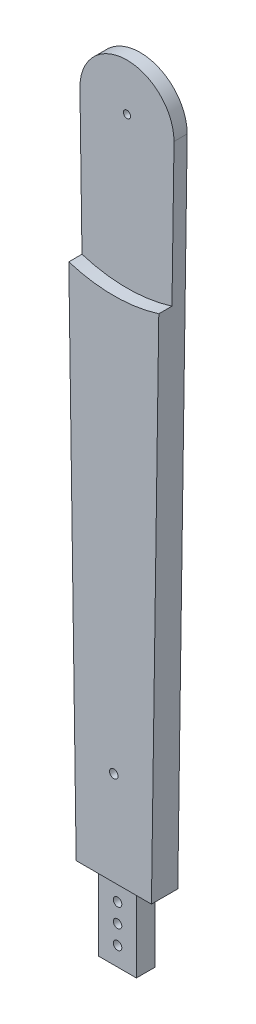
ISO-10303-21;
HEADER;
FILE_DESCRIPTION(('STEP AP214'),'2;1');
FILE_NAME('part.step','',(''),(''),'','','');
FILE_SCHEMA(('AUTOMOTIVE_DESIGN { 1 0 10303 214 1 1 1 1 }'));
ENDSEC;
DATA;
#1=APPLICATION_CONTEXT('core data for automotive mechanical design processes');
#2=APPLICATION_PROTOCOL_DEFINITION('international standard','automotive_design',2000,#1);
#3=PRODUCT_CONTEXT('',#1,'mechanical');
#4=PRODUCT('Part','Part','',(#3));
#5=PRODUCT_RELATED_PRODUCT_CATEGORY('part','',(#4));
#6=PRODUCT_DEFINITION_FORMATION('','',#4);
#7=PRODUCT_DEFINITION_CONTEXT('part definition',#1,'design');
#8=PRODUCT_DEFINITION('design','',#6,#7);
#9=PRODUCT_DEFINITION_SHAPE('','',#8);
#10=(LENGTH_UNIT() NAMED_UNIT(*) SI_UNIT(.MILLI.,.METRE.));
#11=(NAMED_UNIT(*) PLANE_ANGLE_UNIT() SI_UNIT($,.RADIAN.));
#12=(NAMED_UNIT(*) SI_UNIT($,.STERADIAN.) SOLID_ANGLE_UNIT());
#13=UNCERTAINTY_MEASURE_WITH_UNIT(LENGTH_MEASURE(1.E-05),#10,'distance_accuracy_value','');
#14=(GEOMETRIC_REPRESENTATION_CONTEXT(3) GLOBAL_UNCERTAINTY_ASSIGNED_CONTEXT((#13)) GLOBAL_UNIT_ASSIGNED_CONTEXT((#10,
#11,#12)) REPRESENTATION_CONTEXT('',''));
#15=CARTESIAN_POINT('',(0.,0.,0.));
#16=DIRECTION('',(0.,0.,1.));
#17=DIRECTION('',(1.,0.,0.));
#18=AXIS2_PLACEMENT_3D('',#15,#16,#17);
#19=CARTESIAN_POINT('',(0.,-380.,-4.99999999999999));
#20=DIRECTION('',(0.,0.,1.));
#21=DIRECTION('',(1.,0.,0.));
#22=AXIS2_PLACEMENT_3D('',#19,#20,#21);
#23=CYLINDRICAL_SURFACE('',#22,2.25);
#24=CARTESIAN_POINT('',(0.,-380.,-4.99999999999999));
#25=DIRECTION('',(0.,0.,1.));
#26=DIRECTION('',(1.,0.,0.));
#27=AXIS2_PLACEMENT_3D('',#24,#25,#26);
#28=CIRCLE('',#27,2.25);
#29=CARTESIAN_POINT('',(2.25,-380.,-4.99999999999999));
#30=VERTEX_POINT('',#29);
#31=EDGE_CURVE('E48',#30,#30,#28,.T.);
#32=CARTESIAN_POINT('',(0.,-380.,5.));
#33=DIRECTION('',(0.,0.,1.));
#34=DIRECTION('',(1.,0.,0.));
#35=AXIS2_PLACEMENT_3D('',#32,#33,#34);
#36=CIRCLE('',#35,2.25);
#37=CARTESIAN_POINT('',(2.25,-380.,5.));
#38=VERTEX_POINT('',#37);
#39=EDGE_CURVE('E11',#38,#38,#36,.T.);
#40=CARTESIAN_POINT('',(2.25,-380.,-4.99999999999999));
#41=CARTESIAN_POINT('',(2.25,-380.,-4.89583333333332));
#42=CARTESIAN_POINT('',(2.25,-380.,-4.79166666666666));
#43=CARTESIAN_POINT('',(2.25,-380.,-4.58333333333333));
#44=CARTESIAN_POINT('',(2.25,-380.,-4.47916666666666));
#45=CARTESIAN_POINT('',(2.25,-380.,-4.27083333333333));
#46=CARTESIAN_POINT('',(2.25,-380.,-4.16666666666666));
#47=CARTESIAN_POINT('',(2.25,-380.,-3.95833333333333));
#48=CARTESIAN_POINT('',(2.25,-380.,-3.85416666666666));
#49=CARTESIAN_POINT('',(2.25,-380.,-3.64583333333333));
#50=CARTESIAN_POINT('',(2.25,-380.,-3.54166666666666));
#51=CARTESIAN_POINT('',(2.25,-380.,-3.33333333333333));
#52=CARTESIAN_POINT('',(2.25,-380.,-3.22916666666666));
#53=CARTESIAN_POINT('',(2.25,-380.,-3.02083333333333));
#54=CARTESIAN_POINT('',(2.25,-380.,-2.91666666666666));
#55=CARTESIAN_POINT('',(2.25,-380.,-2.70833333333333));
#56=CARTESIAN_POINT('',(2.25,-380.,-2.60416666666666));
#57=CARTESIAN_POINT('',(2.25,-380.,-2.39583333333333));
#58=CARTESIAN_POINT('',(2.25,-380.,-2.29166666666666));
#59=CARTESIAN_POINT('',(2.25,-380.,-2.08333333333333));
#60=CARTESIAN_POINT('',(2.25,-380.,-1.97916666666666));
#61=CARTESIAN_POINT('',(2.25,-380.,-1.77083333333333));
#62=CARTESIAN_POINT('',(2.25,-380.,-1.66666666666666));
#63=CARTESIAN_POINT('',(2.25,-380.,-1.45833333333333));
#64=CARTESIAN_POINT('',(2.25,-380.,-1.35416666666666));
#65=CARTESIAN_POINT('',(2.25,-380.,-1.14583333333333));
#66=CARTESIAN_POINT('',(2.25,-380.,-1.04166666666666));
#67=CARTESIAN_POINT('',(2.25,-380.,-0.83333333333333));
#68=CARTESIAN_POINT('',(2.25,-380.,-0.729166666666663));
#69=CARTESIAN_POINT('',(2.25,-380.,-0.52083333333333));
#70=CARTESIAN_POINT('',(2.25,-380.,-0.416666666666663));
#71=CARTESIAN_POINT('',(2.25,-380.,-0.20833333333333));
#72=CARTESIAN_POINT('',(2.25,-380.,-0.104166666666664));
#73=CARTESIAN_POINT('',(2.25,-380.,0.104166666666669));
#74=CARTESIAN_POINT('',(2.25,-380.,0.208333333333336));
#75=CARTESIAN_POINT('',(2.25,-380.,0.416666666666668));
#76=CARTESIAN_POINT('',(2.25,-380.,0.520833333333335));
#77=CARTESIAN_POINT('',(2.25,-380.,0.729166666666668));
#78=CARTESIAN_POINT('',(2.25,-380.,0.833333333333335));
#79=CARTESIAN_POINT('',(2.25,-380.,1.04166666666667));
#80=CARTESIAN_POINT('',(2.25,-380.,1.14583333333333));
#81=CARTESIAN_POINT('',(2.25,-380.,1.35416666666667));
#82=CARTESIAN_POINT('',(2.25,-380.,1.45833333333333));
#83=CARTESIAN_POINT('',(2.25,-380.,1.66666666666667));
#84=CARTESIAN_POINT('',(2.25,-380.,1.77083333333333));
#85=CARTESIAN_POINT('',(2.25,-380.,1.97916666666667));
#86=CARTESIAN_POINT('',(2.25,-380.,2.08333333333333));
#87=CARTESIAN_POINT('',(2.25,-380.,2.29166666666667));
#88=CARTESIAN_POINT('',(2.25,-380.,2.39583333333333));
#89=CARTESIAN_POINT('',(2.25,-380.,2.60416666666667));
#90=CARTESIAN_POINT('',(2.25,-380.,2.70833333333333));
#91=CARTESIAN_POINT('',(2.25,-380.,2.91666666666667));
#92=CARTESIAN_POINT('',(2.25,-380.,3.02083333333333));
#93=CARTESIAN_POINT('',(2.25,-380.,3.22916666666666));
#94=CARTESIAN_POINT('',(2.25,-380.,3.33333333333333));
#95=CARTESIAN_POINT('',(2.25,-380.,3.54166666666666));
#96=CARTESIAN_POINT('',(2.25,-380.,3.64583333333333));
#97=CARTESIAN_POINT('',(2.25,-380.,3.85416666666666));
#98=CARTESIAN_POINT('',(2.25,-380.,3.95833333333333));
#99=CARTESIAN_POINT('',(2.25,-380.,4.16666666666666));
#100=CARTESIAN_POINT('',(2.25,-380.,4.27083333333333));
#101=CARTESIAN_POINT('',(2.25,-380.,4.47916666666666));
#102=CARTESIAN_POINT('',(2.25,-380.,4.58333333333333));
#103=CARTESIAN_POINT('',(2.25,-380.,4.79166666666666));
#104=CARTESIAN_POINT('',(2.25,-380.,4.89583333333333));
#105=CARTESIAN_POINT('',(2.25,-380.,5.));
#106=B_SPLINE_CURVE_WITH_KNOTS('',3,(#40,#41,#42,#43,#44,#45,#46,#47,#48,#49,#50,#51,#52,#53,
#54,#55,#56,#57,#58,#59,#60,#61,#62,#63,#64,#65,#66,#67,#68,#69,#70,#71,#72,#73,#74,#75,#76,#77,
#78,#79,#80,#81,#82,#83,#84,#85,#86,#87,#88,#89,#90,#91,#92,#93,#94,#95,#96,#97,#98,#99,#100,
#101,#102,#103,#104,#105),.UNSPECIFIED.,.F.,.F.,(4,2,2,2,2,2,2,2,2,2,2,2,2,2,2,2,2,2,2,2,2,2,2,
2,2,2,2,2,2,2,2,2,4),(0.,0.312499999999999,0.624999999999999,0.937499999999998,1.25,1.5625,
1.875,2.1875,2.5,2.8125,3.125,3.4375,3.74999999999999,4.06249999999999,4.37499999999999,
4.68749999999999,4.99999999999999,5.31249999999999,5.62499999999999,5.93749999999999,
6.24999999999999,6.56249999999999,6.87499999999999,7.18749999999999,7.49999999999999,
7.81249999999999,8.12499999999999,8.43749999999999,8.74999999999999,9.06249999999999,
9.37499999999999,9.68749999999999,9.99999999999999),.UNSPECIFIED.);
#107=EDGE_CURVE('BSEAM41',#30,#38,#106,.T.);
#108=ORIENTED_EDGE('',*,*,#31,.F.);
#109=ORIENTED_EDGE('',*,*,#39,.T.);
#110=ORIENTED_EDGE('',*,*,#107,.T.);
#111=ORIENTED_EDGE('',*,*,#107,.F.);
#112=EDGE_LOOP('',(#108,#110,#109,#111));
#113=FACE_BOUND('',#112,.T.);
#114=ADVANCED_FACE('F41',(#113),#23,.F.);
#115=CARTESIAN_POINT('',(0.,-350.,7.));
#116=DIRECTION('',(0.,1.,0.));
#117=DIRECTION('',(0.,0.,1.));
#118=AXIS2_PLACEMENT_3D('',#115,#116,#117);
#119=PLANE('',#118);
#120=DIRECTION('',(1.,0.,0.));
#121=VECTOR('',#120,1.);
#122=CARTESIAN_POINT('',(0.,-350.,-7.));
#123=LINE('',#122,#121);
#124=CARTESIAN_POINT('',(-20.0000000000004,-350.,-7.));
#125=VERTEX_POINT('',#124);
#126=CARTESIAN_POINT('',(19.9999999999996,-350.,-7.));
#127=VERTEX_POINT('',#126);
#128=EDGE_CURVE('E182',#125,#127,#123,.T.);
#129=ORIENTED_EDGE('',*,*,#128,.T.);
#130=DIRECTION('',(0.,0.,-1.));
#131=VECTOR('',#130,1.);
#132=CARTESIAN_POINT('',(19.9999999999996,-350.,7.));
#133=LINE('',#132,#131);
#134=CARTESIAN_POINT('',(19.9999999999996,-350.,7.));
#135=VERTEX_POINT('',#134);
#136=EDGE_CURVE('E193',#135,#127,#133,.T.);
#137=ORIENTED_EDGE('',*,*,#136,.F.);
#138=DIRECTION('',(1.,0.,0.));
#139=VECTOR('',#138,1.);
#140=CARTESIAN_POINT('',(0.,-350.,7.));
#141=LINE('',#140,#139);
#142=CARTESIAN_POINT('',(-20.0000000000004,-350.,7.));
#143=VERTEX_POINT('',#142);
#144=EDGE_CURVE('E173',#143,#135,#141,.T.);
#145=ORIENTED_EDGE('',*,*,#144,.F.);
#146=DIRECTION('',(0.,0.,-1.));
#147=VECTOR('',#146,1.);
#148=CARTESIAN_POINT('',(-20.0000000000004,-350.,7.));
#149=LINE('',#148,#147);
#150=EDGE_CURVE('E195',#143,#125,#149,.T.);
#151=ORIENTED_EDGE('',*,*,#150,.T.);
#152=EDGE_LOOP('',(#129,#137,#145,#151));
#153=FACE_BOUND('',#152,.T.);
#154=DIRECTION('',(0.,0.,1.));
#155=VECTOR('',#154,1.);
#156=CARTESIAN_POINT('',(10.,-350.,-5.));
#157=LINE('',#156,#155);
#158=CARTESIAN_POINT('',(10.,-350.,-5.));
#159=VERTEX_POINT('',#158);
#160=CARTESIAN_POINT('',(10.,-350.,5.));
#161=VERTEX_POINT('',#160);
#162=EDGE_CURVE('E55',#159,#161,#157,.T.);
#163=ORIENTED_EDGE('',*,*,#162,.F.);
#164=DIRECTION('',(1.,0.,0.));
#165=VECTOR('',#164,1.);
#166=CARTESIAN_POINT('',(-10.,-350.,-5.));
#167=LINE('',#166,#165);
#168=CARTESIAN_POINT('',(-10.,-350.,-5.));
#169=VERTEX_POINT('',#168);
#170=EDGE_CURVE('E59',#169,#159,#167,.T.);
#171=ORIENTED_EDGE('',*,*,#170,.F.);
#172=DIRECTION('',(0.,0.,-1.));
#173=VECTOR('',#172,1.);
#174=CARTESIAN_POINT('',(-10.,-350.,-5.));
#175=LINE('',#174,#173);
#176=CARTESIAN_POINT('',(-10.,-350.,5.));
#177=VERTEX_POINT('',#176);
#178=EDGE_CURVE('E394',#177,#169,#175,.T.);
#179=ORIENTED_EDGE('',*,*,#178,.F.);
#180=DIRECTION('',(-1.,0.,0.));
#181=VECTOR('',#180,1.);
#182=CARTESIAN_POINT('',(-10.,-350.,5.));
#183=LINE('',#182,#181);
#184=EDGE_CURVE('E392',#161,#177,#183,.T.);
#185=ORIENTED_EDGE('',*,*,#184,.F.);
#186=EDGE_LOOP('',(#163,#171,#179,#185));
#187=FACE_BOUND('',#186,.T.);
#188=ADVANCED_FACE('F206',(#153,#187),#119,.F.);
#189=CARTESIAN_POINT('',(0.,0.,7.));
#190=DIRECTION('',(0.,0.,-1.));
#191=DIRECTION('',(-1.,0.,0.));
#192=AXIS2_PLACEMENT_3D('',#189,#190,#191);
#193=CYLINDRICAL_SURFACE('',#192,25.);
#194=CARTESIAN_POINT('',(0.,0.,0.));
#195=DIRECTION('',(0.,0.,1.));
#196=DIRECTION('',(1.,0.,0.));
#197=AXIS2_PLACEMENT_3D('',#194,#195,#196);
#198=CIRCLE('',#197,25.);
#199=CARTESIAN_POINT('',(25.,0.,0.));
#200=VERTEX_POINT('',#199);
#201=CARTESIAN_POINT('',(-25.,0.,0.));
#202=VERTEX_POINT('',#201);
#203=EDGE_CURVE('E198',#200,#202,#198,.T.);
#204=ORIENTED_EDGE('',*,*,#203,.F.);
#205=DIRECTION('',(0.,0.,-1.));
#206=VECTOR('',#205,1.);
#207=CARTESIAN_POINT('',(25.,0.,7.));
#208=LINE('',#207,#206);
#209=CARTESIAN_POINT('',(25.,0.,-7.));
#210=VERTEX_POINT('',#209);
#211=EDGE_CURVE('E191',#200,#210,#208,.T.);
#212=ORIENTED_EDGE('',*,*,#211,.T.);
#213=CARTESIAN_POINT('',(0.,0.,-7.));
#214=DIRECTION('',(0.,0.,1.));
#215=DIRECTION('',(1.,0.,0.));
#216=AXIS2_PLACEMENT_3D('',#213,#214,#215);
#217=CIRCLE('',#216,25.);
#218=CARTESIAN_POINT('',(-25.,0.,-7.));
#219=VERTEX_POINT('',#218);
#220=EDGE_CURVE('E174',#210,#219,#217,.T.);
#221=ORIENTED_EDGE('',*,*,#220,.T.);
#222=DIRECTION('',(0.,0.,-1.));
#223=VECTOR('',#222,1.);
#224=CARTESIAN_POINT('',(-25.,0.,7.));
#225=LINE('',#224,#223);
#226=EDGE_CURVE('E179',#202,#219,#225,.T.);
#227=ORIENTED_EDGE('',*,*,#226,.F.);
#228=EDGE_LOOP('',(#204,#212,#221,#227));
#229=FACE_BOUND('',#228,.T.);
#230=ADVANCED_FACE('F248',(#229),#193,.T.);
#231=CARTESIAN_POINT('',(-24.994899000204,-0.357069985717169,7.));
#232=DIRECTION('',(0.99989797479951,0.0142842567828489,0.));
#233=DIRECTION('',(-0.0142842567828489,0.99989797479951,0.));
#234=AXIS2_PLACEMENT_3D('',#231,#232,#233);
#235=PLANE('',#234);
#236=DIRECTION('',(0.0142842567828489,-0.99989797479951,0.));
#237=VECTOR('',#236,1.);
#238=CARTESIAN_POINT('',(-24.994899000204,-0.357069985717169,7.));
#239=LINE('',#238,#237);
#240=CARTESIAN_POINT('',(-23.9093774789685,-76.3435764722101,7.));
#241=VERTEX_POINT('',#240);
#242=EDGE_CURVE('E171',#241,#143,#239,.T.);
#243=ORIENTED_EDGE('',*,*,#242,.F.);
#244=DIRECTION('',(0.,0.,1.));
#245=VECTOR('',#244,1.);
#246=CARTESIAN_POINT('',(-23.9093774789685,-76.3435764722101,0.));
#247=LINE('',#246,#245);
#248=CARTESIAN_POINT('',(-23.9093774789685,-76.3435764722101,0.));
#249=VERTEX_POINT('',#248);
#250=EDGE_CURVE('E162',#241,#249,#247,.F.);
#251=ORIENTED_EDGE('',*,*,#250,.T.);
#252=DIRECTION('',(0.0142842567828489,-0.99989797479951,0.));
#253=VECTOR('',#252,1.);
#254=CARTESIAN_POINT('',(-24.994899000204,-0.357069985717169,0.));
#255=LINE('',#254,#253);
#256=EDGE_CURVE('E168',#202,#249,#255,.T.);
#257=ORIENTED_EDGE('',*,*,#256,.F.);
#258=ORIENTED_EDGE('',*,*,#226,.T.);
#259=DIRECTION('',(0.0142842567828489,-0.99989797479951,0.));
#260=VECTOR('',#259,1.);
#261=CARTESIAN_POINT('',(-24.994899000204,-0.357069985717169,-7.));
#262=LINE('',#261,#260);
#263=EDGE_CURVE('E170',#219,#125,#262,.T.);
#264=ORIENTED_EDGE('',*,*,#263,.T.);
#265=ORIENTED_EDGE('',*,*,#150,.F.);
#266=EDGE_LOOP('',(#243,#251,#257,#258,#264,#265));
#267=FACE_BOUND('',#266,.T.);
#268=ADVANCED_FACE('F251',(#267),#235,.F.);
#269=CARTESIAN_POINT('',(24.994899000204,-0.357069985717232,7.));
#270=DIRECTION('',(0.99989797479951,-0.0142842567828514,0.));
#271=DIRECTION('',(0.0142842567828514,0.99989797479951,0.));
#272=AXIS2_PLACEMENT_3D('',#269,#270,#271);
#273=PLANE('',#272);
#274=DIRECTION('',(0.,0.,1.));
#275=VECTOR('',#274,1.);
#276=CARTESIAN_POINT('',(23.9093774789683,-76.3435764722102,0.));
#277=LINE('',#276,#275);
#278=CARTESIAN_POINT('',(23.9093774789683,-76.3435764722102,7.));
#279=VERTEX_POINT('',#278);
#280=CARTESIAN_POINT('',(23.9093774789683,-76.3435764722102,0.));
#281=VERTEX_POINT('',#280);
#282=EDGE_CURVE('E159',#279,#281,#277,.F.);
#283=ORIENTED_EDGE('',*,*,#282,.F.);
#284=DIRECTION('',(-0.0142842567828514,-0.99989797479951,0.));
#285=VECTOR('',#284,1.);
#286=CARTESIAN_POINT('',(24.994899000204,-0.357069985717232,7.));
#287=LINE('',#286,#285);
#288=EDGE_CURVE('E177',#279,#135,#287,.T.);
#289=ORIENTED_EDGE('',*,*,#288,.T.);
#290=ORIENTED_EDGE('',*,*,#136,.T.);
#291=DIRECTION('',(-0.0142842567828514,-0.99989797479951,0.));
#292=VECTOR('',#291,1.);
#293=CARTESIAN_POINT('',(24.994899000204,-0.357069985717232,-7.));
#294=LINE('',#293,#292);
#295=EDGE_CURVE('E185',#210,#127,#294,.T.);
#296=ORIENTED_EDGE('',*,*,#295,.F.);
#297=ORIENTED_EDGE('',*,*,#211,.F.);
#298=DIRECTION('',(-0.0142842567828514,-0.99989797479951,0.));
#299=VECTOR('',#298,1.);
#300=CARTESIAN_POINT('',(24.994899000204,-0.357069985717232,0.));
#301=LINE('',#300,#299);
#302=EDGE_CURVE('E165',#200,#281,#301,.T.);
#303=ORIENTED_EDGE('',*,*,#302,.T.);
#304=EDGE_LOOP('',(#283,#289,#290,#296,#297,#303));
#305=FACE_BOUND('',#304,.T.);
#306=ADVANCED_FACE('F243',(#305),#273,.T.);
#307=CARTESIAN_POINT('',(0.,0.,7.));
#308=DIRECTION('',(0.,0.,1.));
#309=DIRECTION('',(1.,0.,0.));
#310=AXIS2_PLACEMENT_3D('',#307,#308,#309);
#311=PLANE('',#310);
#312=CARTESIAN_POINT('',(0.,-300.,7.));
#313=DIRECTION('',(0.,0.,1.));
#314=DIRECTION('',(1.,0.,0.));
#315=AXIS2_PLACEMENT_3D('',#312,#313,#314);
#316=CIRCLE('',#315,2.25);
#317=CARTESIAN_POINT('',(2.25,-300.,7.));
#318=VERTEX_POINT('',#317);
#319=EDGE_CURVE('E148',#318,#318,#316,.T.);
#320=ORIENTED_EDGE('',*,*,#319,.F.);
#321=EDGE_LOOP('',(#320));
#322=FACE_BOUND('',#321,.T.);
#323=CARTESIAN_POINT('',(0.,0.,7.));
#324=DIRECTION('',(0.,0.,1.));
#325=DIRECTION('',(1.,0.,0.));
#326=AXIS2_PLACEMENT_3D('',#323,#324,#325);
#327=CIRCLE('',#326,80.);
#328=EDGE_CURVE('E153',#241,#279,#327,.T.);
#329=ORIENTED_EDGE('',*,*,#328,.F.);
#330=ORIENTED_EDGE('',*,*,#242,.T.);
#331=ORIENTED_EDGE('',*,*,#144,.T.);
#332=ORIENTED_EDGE('',*,*,#288,.F.);
#333=EDGE_LOOP('',(#329,#330,#331,#332));
#334=FACE_BOUND('',#333,.T.);
#335=ADVANCED_FACE('F240',(#322,#334),#311,.T.);
#336=CARTESIAN_POINT('',(0.,0.,-7.));
#337=DIRECTION('',(0.,0.,1.));
#338=DIRECTION('',(1.,0.,0.));
#339=AXIS2_PLACEMENT_3D('',#336,#337,#338);
#340=PLANE('',#339);
#341=CARTESIAN_POINT('',(0.,0.,-6.99999999999998));
#342=DIRECTION('',(0.,0.,1.));
#343=DIRECTION('',(1.,0.,0.));
#344=AXIS2_PLACEMENT_3D('',#341,#342,#343);
#345=CIRCLE('',#344,1.9);
#346=CARTESIAN_POINT('',(1.9,0.,-6.99999999999998));
#347=VERTEX_POINT('',#346);
#348=EDGE_CURVE('E141',#347,#347,#345,.T.);
#349=ORIENTED_EDGE('',*,*,#348,.T.);
#350=EDGE_LOOP('',(#349));
#351=FACE_BOUND('',#350,.T.);
#352=CARTESIAN_POINT('',(0.,-300.,-6.99999999999999));
#353=DIRECTION('',(0.,0.,1.));
#354=DIRECTION('',(1.,0.,0.));
#355=AXIS2_PLACEMENT_3D('',#352,#353,#354);
#356=CIRCLE('',#355,2.25);
#357=CARTESIAN_POINT('',(2.25,-300.,-6.99999999999999));
#358=VERTEX_POINT('',#357);
#359=EDGE_CURVE('E150',#358,#358,#356,.T.);
#360=ORIENTED_EDGE('',*,*,#359,.T.);
#361=EDGE_LOOP('',(#360));
#362=FACE_BOUND('',#361,.T.);
#363=ORIENTED_EDGE('',*,*,#263,.F.);
#364=ORIENTED_EDGE('',*,*,#220,.F.);
#365=ORIENTED_EDGE('',*,*,#295,.T.);
#366=ORIENTED_EDGE('',*,*,#128,.F.);
#367=EDGE_LOOP('',(#363,#364,#365,#366));
#368=FACE_BOUND('',#367,.T.);
#369=ADVANCED_FACE('F235',(#351,#362,#368),#340,.F.);
#370=CARTESIAN_POINT('',(0.,0.,0.));
#371=DIRECTION('',(0.,0.,1.));
#372=DIRECTION('',(1.,0.,0.));
#373=AXIS2_PLACEMENT_3D('',#370,#371,#372);
#374=PLANE('',#373);
#375=CARTESIAN_POINT('',(0.,0.,0.));
#376=DIRECTION('',(0.,0.,1.));
#377=DIRECTION('',(1.,0.,0.));
#378=AXIS2_PLACEMENT_3D('',#375,#376,#377);
#379=CIRCLE('',#378,1.9);
#380=CARTESIAN_POINT('',(1.9,0.,0.));
#381=VERTEX_POINT('',#380);
#382=EDGE_CURVE('E138',#381,#381,#379,.T.);
#383=ORIENTED_EDGE('',*,*,#382,.F.);
#384=EDGE_LOOP('',(#383));
#385=FACE_BOUND('',#384,.T.);
#386=ORIENTED_EDGE('',*,*,#256,.T.);
#387=CARTESIAN_POINT('',(0.,0.,0.));
#388=DIRECTION('',(0.,0.,1.));
#389=DIRECTION('',(1.,0.,0.));
#390=AXIS2_PLACEMENT_3D('',#387,#388,#389);
#391=CIRCLE('',#390,80.);
#392=EDGE_CURVE('E156',#249,#281,#391,.T.);
#393=ORIENTED_EDGE('',*,*,#392,.T.);
#394=ORIENTED_EDGE('',*,*,#302,.F.);
#395=ORIENTED_EDGE('',*,*,#203,.T.);
#396=EDGE_LOOP('',(#386,#393,#394,#395));
#397=FACE_BOUND('',#396,.T.);
#398=ADVANCED_FACE('F232',(#385,#397),#374,.T.);
#399=CARTESIAN_POINT('',(0.,0.,0.));
#400=DIRECTION('',(0.,0.,1.));
#401=DIRECTION('',(1.,0.,0.));
#402=AXIS2_PLACEMENT_3D('',#399,#400,#401);
#403=CYLINDRICAL_SURFACE('',#402,80.);
#404=ORIENTED_EDGE('',*,*,#328,.T.);
#405=ORIENTED_EDGE('',*,*,#282,.T.);
#406=ORIENTED_EDGE('',*,*,#392,.F.);
#407=ORIENTED_EDGE('',*,*,#250,.F.);
#408=EDGE_LOOP('',(#404,#405,#406,#407));
#409=FACE_BOUND('',#408,.T.);
#410=ADVANCED_FACE('F230',(#409),#403,.F.);
#411=CARTESIAN_POINT('',(0.,-300.,-6.99999999999999));
#412=DIRECTION('',(0.,0.,1.));
#413=DIRECTION('',(1.,0.,0.));
#414=AXIS2_PLACEMENT_3D('',#411,#412,#413);
#415=CYLINDRICAL_SURFACE('',#414,2.25);
#416=ORIENTED_EDGE('',*,*,#359,.F.);
#417=EDGE_LOOP('',(#416));
#418=FACE_BOUND('',#417,.T.);
#419=ORIENTED_EDGE('',*,*,#319,.T.);
#420=EDGE_LOOP('',(#419));
#421=FACE_BOUND('',#420,.T.);
#422=ADVANCED_FACE('F226',(#418,#421),#415,.F.);
#423=CARTESIAN_POINT('',(0.,0.,-6.99999999999998));
#424=DIRECTION('',(0.,0.,1.));
#425=DIRECTION('',(1.,0.,0.));
#426=AXIS2_PLACEMENT_3D('',#423,#424,#425);
#427=CYLINDRICAL_SURFACE('',#426,1.9);
#428=ORIENTED_EDGE('',*,*,#348,.F.);
#429=EDGE_LOOP('',(#428));
#430=FACE_BOUND('',#429,.T.);
#431=ORIENTED_EDGE('',*,*,#382,.T.);
#432=EDGE_LOOP('',(#431));
#433=FACE_BOUND('',#432,.T.);
#434=ADVANCED_FACE('F218',(#430,#433),#427,.F.);
#435=CARTESIAN_POINT('',(10.,-390.,-5.));
#436=DIRECTION('',(-1.,0.,0.));
#437=DIRECTION('',(0.,0.,1.));
#438=AXIS2_PLACEMENT_3D('',#435,#436,#437);
#439=PLANE('',#438);
#440=ORIENTED_EDGE('',*,*,#162,.T.);
#441=DIRECTION('',(0.,1.,0.));
#442=VECTOR('',#441,1.);
#443=CARTESIAN_POINT('',(10.,-390.,5.));
#444=LINE('',#443,#442);
#445=CARTESIAN_POINT('',(10.,-390.,5.));
#446=VERTEX_POINT('',#445);
#447=EDGE_CURVE('E121',#446,#161,#444,.T.);
#448=ORIENTED_EDGE('',*,*,#447,.F.);
#449=DIRECTION('',(0.,0.,1.));
#450=VECTOR('',#449,1.);
#451=CARTESIAN_POINT('',(10.,-390.,-5.));
#452=LINE('',#451,#450);
#453=CARTESIAN_POINT('',(10.,-390.,-5.));
#454=VERTEX_POINT('',#453);
#455=EDGE_CURVE('E127',#454,#446,#452,.T.);
#456=ORIENTED_EDGE('',*,*,#455,.F.);
#457=DIRECTION('',(0.,1.,0.));
#458=VECTOR('',#457,1.);
#459=CARTESIAN_POINT('',(10.,-390.,-5.));
#460=LINE('',#459,#458);
#461=EDGE_CURVE('E390',#454,#159,#460,.T.);
#462=ORIENTED_EDGE('',*,*,#461,.T.);
#463=EDGE_LOOP('',(#440,#448,#456,#462));
#464=FACE_BOUND('',#463,.T.);
#465=ADVANCED_FACE('F137',(#464),#439,.F.);
#466=CARTESIAN_POINT('',(-10.,-390.,5.));
#467=DIRECTION('',(0.,0.,-1.));
#468=DIRECTION('',(-1.,0.,0.));
#469=AXIS2_PLACEMENT_3D('',#466,#467,#468);
#470=PLANE('',#469);
#471=CARTESIAN_POINT('',(0.,-370.,5.));
#472=DIRECTION('',(0.,0.,1.));
#473=DIRECTION('',(1.,0.,0.));
#474=AXIS2_PLACEMENT_3D('',#471,#472,#473);
#475=CIRCLE('',#474,2.25);
#476=CARTESIAN_POINT('',(2.25,-370.,5.));
#477=VERTEX_POINT('',#476);
#478=EDGE_CURVE('E378',#477,#477,#475,.T.);
#479=ORIENTED_EDGE('',*,*,#478,.F.);
#480=EDGE_LOOP('',(#479));
#481=FACE_BOUND('',#480,.T.);
#482=CARTESIAN_POINT('',(0.,-360.,5.));
#483=DIRECTION('',(0.,0.,1.));
#484=DIRECTION('',(1.,0.,0.));
#485=AXIS2_PLACEMENT_3D('',#482,#483,#484);
#486=CIRCLE('',#485,2.25);
#487=CARTESIAN_POINT('',(2.25,-360.,5.));
#488=VERTEX_POINT('',#487);
#489=EDGE_CURVE('E379',#488,#488,#486,.T.);
#490=ORIENTED_EDGE('',*,*,#489,.F.);
#491=EDGE_LOOP('',(#490));
#492=FACE_BOUND('',#491,.T.);
#493=ORIENTED_EDGE('',*,*,#184,.T.);
#494=DIRECTION('',(0.,1.,0.));
#495=VECTOR('',#494,1.);
#496=CARTESIAN_POINT('',(-10.,-390.,5.));
#497=LINE('',#496,#495);
#498=CARTESIAN_POINT('',(-10.,-390.,5.));
#499=VERTEX_POINT('',#498);
#500=EDGE_CURVE('E123',#499,#177,#497,.T.);
#501=ORIENTED_EDGE('',*,*,#500,.F.);
#502=DIRECTION('',(-1.,0.,0.));
#503=VECTOR('',#502,1.);
#504=CARTESIAN_POINT('',(-10.,-390.,5.));
#505=LINE('',#504,#503);
#506=EDGE_CURVE('E115',#446,#499,#505,.T.);
#507=ORIENTED_EDGE('',*,*,#506,.F.);
#508=ORIENTED_EDGE('',*,*,#447,.T.);
#509=EDGE_LOOP('',(#493,#501,#507,#508));
#510=FACE_BOUND('',#509,.T.);
#511=ORIENTED_EDGE('',*,*,#39,.F.);
#512=EDGE_LOOP('',(#511));
#513=FACE_BOUND('',#512,.T.);
#514=ADVANCED_FACE('F118',(#481,#492,#510,#513),#470,.F.);
#515=CARTESIAN_POINT('',(-10.,-390.,-5.));
#516=DIRECTION('',(1.,0.,0.));
#517=DIRECTION('',(0.,0.,-1.));
#518=AXIS2_PLACEMENT_3D('',#515,#516,#517);
#519=PLANE('',#518);
#520=ORIENTED_EDGE('',*,*,#178,.T.);
#521=DIRECTION('',(0.,1.,0.));
#522=VECTOR('',#521,1.);
#523=CARTESIAN_POINT('',(-10.,-390.,-5.));
#524=LINE('',#523,#522);
#525=CARTESIAN_POINT('',(-10.,-390.,-5.));
#526=VERTEX_POINT('',#525);
#527=EDGE_CURVE('E143',#526,#169,#524,.T.);
#528=ORIENTED_EDGE('',*,*,#527,.F.);
#529=DIRECTION('',(0.,0.,-1.));
#530=VECTOR('',#529,1.);
#531=CARTESIAN_POINT('',(-10.,-390.,-5.));
#532=LINE('',#531,#530);
#533=EDGE_CURVE('E126',#499,#526,#532,.T.);
#534=ORIENTED_EDGE('',*,*,#533,.F.);
#535=ORIENTED_EDGE('',*,*,#500,.T.);
#536=EDGE_LOOP('',(#520,#528,#534,#535));
#537=FACE_BOUND('',#536,.T.);
#538=ADVANCED_FACE('F209',(#537),#519,.F.);
#539=CARTESIAN_POINT('',(-10.,-390.,-5.));
#540=DIRECTION('',(0.,0.,1.));
#541=DIRECTION('',(1.,0.,0.));
#542=AXIS2_PLACEMENT_3D('',#539,#540,#541);
#543=PLANE('',#542);
#544=CARTESIAN_POINT('',(0.,-370.,-4.99999999999999));
#545=DIRECTION('',(0.,0.,1.));
#546=DIRECTION('',(1.,0.,0.));
#547=AXIS2_PLACEMENT_3D('',#544,#545,#546);
#548=CIRCLE('',#547,2.25);
#549=CARTESIAN_POINT('',(2.25,-370.,-4.99999999999999));
#550=VERTEX_POINT('',#549);
#551=EDGE_CURVE('E376',#550,#550,#548,.T.);
#552=ORIENTED_EDGE('',*,*,#551,.T.);
#553=EDGE_LOOP('',(#552));
#554=FACE_BOUND('',#553,.T.);
#555=CARTESIAN_POINT('',(0.,-360.,-4.99999999999999));
#556=DIRECTION('',(0.,0.,1.));
#557=DIRECTION('',(1.,0.,0.));
#558=AXIS2_PLACEMENT_3D('',#555,#556,#557);
#559=CIRCLE('',#558,2.25);
#560=CARTESIAN_POINT('',(2.25,-360.,-4.99999999999999));
#561=VERTEX_POINT('',#560);
#562=EDGE_CURVE('E382',#561,#561,#559,.T.);
#563=ORIENTED_EDGE('',*,*,#562,.T.);
#564=EDGE_LOOP('',(#563));
#565=FACE_BOUND('',#564,.T.);
#566=ORIENTED_EDGE('',*,*,#170,.T.);
#567=ORIENTED_EDGE('',*,*,#461,.F.);
#568=DIRECTION('',(1.,0.,0.));
#569=VECTOR('',#568,1.);
#570=CARTESIAN_POINT('',(-10.,-390.,-5.));
#571=LINE('',#570,#569);
#572=EDGE_CURVE('E132',#526,#454,#571,.T.);
#573=ORIENTED_EDGE('',*,*,#572,.F.);
#574=ORIENTED_EDGE('',*,*,#527,.T.);
#575=EDGE_LOOP('',(#566,#567,#573,#574));
#576=FACE_BOUND('',#575,.T.);
#577=ORIENTED_EDGE('',*,*,#31,.T.);
#578=EDGE_LOOP('',(#577));
#579=FACE_BOUND('',#578,.T.);
#580=ADVANCED_FACE('F202',(#554,#565,#576,#579),#543,.F.);
#581=CARTESIAN_POINT('',(0.,-390.,0.));
#582=DIRECTION('',(0.,1.,0.));
#583=DIRECTION('',(0.,0.,1.));
#584=AXIS2_PLACEMENT_3D('',#581,#582,#583);
#585=PLANE('',#584);
#586=ORIENTED_EDGE('',*,*,#455,.T.);
#587=ORIENTED_EDGE('',*,*,#506,.T.);
#588=ORIENTED_EDGE('',*,*,#533,.T.);
#589=ORIENTED_EDGE('',*,*,#572,.T.);
#590=EDGE_LOOP('',(#586,#587,#588,#589));
#591=FACE_BOUND('',#590,.T.);
#592=ADVANCED_FACE('F130',(#591),#585,.F.);
#593=CARTESIAN_POINT('',(0.,-360.,-4.99999999999999));
#594=DIRECTION('',(0.,0.,1.));
#595=DIRECTION('',(1.,0.,0.));
#596=AXIS2_PLACEMENT_3D('',#593,#594,#595);
#597=CYLINDRICAL_SURFACE('',#596,2.25);
#598=CARTESIAN_POINT('',(2.25,-360.,-4.99999999999999));
#599=CARTESIAN_POINT('',(2.25,-360.,-4.89583333333332));
#600=CARTESIAN_POINT('',(2.25,-360.,-4.79166666666666));
#601=CARTESIAN_POINT('',(2.25,-360.,-4.58333333333333));
#602=CARTESIAN_POINT('',(2.25,-360.,-4.47916666666666));
#603=CARTESIAN_POINT('',(2.25,-360.,-4.27083333333333));
#604=CARTESIAN_POINT('',(2.25,-360.,-4.16666666666666));
#605=CARTESIAN_POINT('',(2.25,-360.,-3.95833333333333));
#606=CARTESIAN_POINT('',(2.25,-360.,-3.85416666666666));
#607=CARTESIAN_POINT('',(2.25,-360.,-3.64583333333333));
#608=CARTESIAN_POINT('',(2.25,-360.,-3.54166666666666));
#609=CARTESIAN_POINT('',(2.25,-360.,-3.33333333333333));
#610=CARTESIAN_POINT('',(2.25,-360.,-3.22916666666666));
#611=CARTESIAN_POINT('',(2.25,-360.,-3.02083333333333));
#612=CARTESIAN_POINT('',(2.25,-360.,-2.91666666666666));
#613=CARTESIAN_POINT('',(2.25,-360.,-2.70833333333333));
#614=CARTESIAN_POINT('',(2.25,-360.,-2.60416666666666));
#615=CARTESIAN_POINT('',(2.25,-360.,-2.39583333333333));
#616=CARTESIAN_POINT('',(2.25,-360.,-2.29166666666666));
#617=CARTESIAN_POINT('',(2.25,-360.,-2.08333333333333));
#618=CARTESIAN_POINT('',(2.25,-360.,-1.97916666666666));
#619=CARTESIAN_POINT('',(2.25,-360.,-1.77083333333333));
#620=CARTESIAN_POINT('',(2.25,-360.,-1.66666666666666));
#621=CARTESIAN_POINT('',(2.25,-360.,-1.45833333333333));
#622=CARTESIAN_POINT('',(2.25,-360.,-1.35416666666666));
#623=CARTESIAN_POINT('',(2.25,-360.,-1.14583333333333));
#624=CARTESIAN_POINT('',(2.25,-360.,-1.04166666666666));
#625=CARTESIAN_POINT('',(2.25,-360.,-0.83333333333333));
#626=CARTESIAN_POINT('',(2.25,-360.,-0.729166666666663));
#627=CARTESIAN_POINT('',(2.25,-360.,-0.52083333333333));
#628=CARTESIAN_POINT('',(2.25,-360.,-0.416666666666663));
#629=CARTESIAN_POINT('',(2.25,-360.,-0.20833333333333));
#630=CARTESIAN_POINT('',(2.25,-360.,-0.104166666666664));
#631=CARTESIAN_POINT('',(2.25,-360.,0.104166666666669));
#632=CARTESIAN_POINT('',(2.25,-360.,0.208333333333336));
#633=CARTESIAN_POINT('',(2.25,-360.,0.416666666666668));
#634=CARTESIAN_POINT('',(2.25,-360.,0.520833333333335));
#635=CARTESIAN_POINT('',(2.25,-360.,0.729166666666668));
#636=CARTESIAN_POINT('',(2.25,-360.,0.833333333333335));
#637=CARTESIAN_POINT('',(2.25,-360.,1.04166666666667));
#638=CARTESIAN_POINT('',(2.25,-360.,1.14583333333333));
#639=CARTESIAN_POINT('',(2.25,-360.,1.35416666666667));
#640=CARTESIAN_POINT('',(2.25,-360.,1.45833333333333));
#641=CARTESIAN_POINT('',(2.25,-360.,1.66666666666667));
#642=CARTESIAN_POINT('',(2.25,-360.,1.77083333333333));
#643=CARTESIAN_POINT('',(2.25,-360.,1.97916666666667));
#644=CARTESIAN_POINT('',(2.25,-360.,2.08333333333333));
#645=CARTESIAN_POINT('',(2.25,-360.,2.29166666666667));
#646=CARTESIAN_POINT('',(2.25,-360.,2.39583333333333));
#647=CARTESIAN_POINT('',(2.25,-360.,2.60416666666667));
#648=CARTESIAN_POINT('',(2.25,-360.,2.70833333333333));
#649=CARTESIAN_POINT('',(2.25,-360.,2.91666666666667));
#650=CARTESIAN_POINT('',(2.25,-360.,3.02083333333333));
#651=CARTESIAN_POINT('',(2.25,-360.,3.22916666666666));
#652=CARTESIAN_POINT('',(2.25,-360.,3.33333333333333));
#653=CARTESIAN_POINT('',(2.25,-360.,3.54166666666666));
#654=CARTESIAN_POINT('',(2.25,-360.,3.64583333333333));
#655=CARTESIAN_POINT('',(2.25,-360.,3.85416666666666));
#656=CARTESIAN_POINT('',(2.25,-360.,3.95833333333333));
#657=CARTESIAN_POINT('',(2.25,-360.,4.16666666666666));
#658=CARTESIAN_POINT('',(2.25,-360.,4.27083333333333));
#659=CARTESIAN_POINT('',(2.25,-360.,4.47916666666666));
#660=CARTESIAN_POINT('',(2.25,-360.,4.58333333333333));
#661=CARTESIAN_POINT('',(2.25,-360.,4.79166666666666));
#662=CARTESIAN_POINT('',(2.25,-360.,4.89583333333333));
#663=CARTESIAN_POINT('',(2.25,-360.,5.));
#664=B_SPLINE_CURVE_WITH_KNOTS('',3,(#598,#599,#600,#601,#602,#603,#604,#605,#606,#607,#608,
#609,#610,#611,#612,#613,#614,#615,#616,#617,#618,#619,#620,#621,#622,#623,#624,#625,#626,#627,
#628,#629,#630,#631,#632,#633,#634,#635,#636,#637,#638,#639,#640,#641,#642,#643,#644,#645,#646,
#647,#648,#649,#650,#651,#652,#653,#654,#655,#656,#657,#658,#659,#660,#661,#662,#663),
.UNSPECIFIED.,.F.,.F.,(4,2,2,2,2,2,2,2,2,2,2,2,2,2,2,2,2,2,2,2,2,2,2,2,2,2,2,2,2,2,2,2,4),(0.,
0.312499999999999,0.624999999999999,0.937499999999998,1.25,1.5625,1.875,2.1875,2.5,2.8125,3.125,
3.4375,3.74999999999999,4.06249999999999,4.37499999999999,4.68749999999999,4.99999999999999,
5.31249999999999,5.62499999999999,5.93749999999999,6.24999999999999,6.56249999999999,
6.87499999999999,7.18749999999999,7.49999999999999,7.81249999999999,8.12499999999999,
8.43749999999999,8.74999999999999,9.06249999999999,9.37499999999999,9.68749999999999,
9.99999999999999),.UNSPECIFIED.);
#665=EDGE_CURVE('BSEAM335',#561,#488,#664,.T.);
#666=ORIENTED_EDGE('',*,*,#562,.F.);
#667=ORIENTED_EDGE('',*,*,#489,.T.);
#668=ORIENTED_EDGE('',*,*,#665,.T.);
#669=ORIENTED_EDGE('',*,*,#665,.F.);
#670=EDGE_LOOP('',(#666,#668,#667,#669));
#671=FACE_BOUND('',#670,.T.);
#672=ADVANCED_FACE('F335',(#671),#597,.F.);
#673=CARTESIAN_POINT('',(0.,-370.,-4.99999999999999));
#674=DIRECTION('',(0.,0.,1.));
#675=DIRECTION('',(1.,0.,0.));
#676=AXIS2_PLACEMENT_3D('',#673,#674,#675);
#677=CYLINDRICAL_SURFACE('',#676,2.25);
#678=CARTESIAN_POINT('',(2.25,-370.,-4.99999999999999));
#679=CARTESIAN_POINT('',(2.25,-370.,-4.89583333333332));
#680=CARTESIAN_POINT('',(2.25,-370.,-4.79166666666666));
#681=CARTESIAN_POINT('',(2.25,-370.,-4.58333333333333));
#682=CARTESIAN_POINT('',(2.25,-370.,-4.47916666666666));
#683=CARTESIAN_POINT('',(2.25,-370.,-4.27083333333333));
#684=CARTESIAN_POINT('',(2.25,-370.,-4.16666666666666));
#685=CARTESIAN_POINT('',(2.25,-370.,-3.95833333333333));
#686=CARTESIAN_POINT('',(2.25,-370.,-3.85416666666666));
#687=CARTESIAN_POINT('',(2.25,-370.,-3.64583333333333));
#688=CARTESIAN_POINT('',(2.25,-370.,-3.54166666666666));
#689=CARTESIAN_POINT('',(2.25,-370.,-3.33333333333333));
#690=CARTESIAN_POINT('',(2.25,-370.,-3.22916666666666));
#691=CARTESIAN_POINT('',(2.25,-370.,-3.02083333333333));
#692=CARTESIAN_POINT('',(2.25,-370.,-2.91666666666666));
#693=CARTESIAN_POINT('',(2.25,-370.,-2.70833333333333));
#694=CARTESIAN_POINT('',(2.25,-370.,-2.60416666666666));
#695=CARTESIAN_POINT('',(2.25,-370.,-2.39583333333333));
#696=CARTESIAN_POINT('',(2.25,-370.,-2.29166666666666));
#697=CARTESIAN_POINT('',(2.25,-370.,-2.08333333333333));
#698=CARTESIAN_POINT('',(2.25,-370.,-1.97916666666666));
#699=CARTESIAN_POINT('',(2.25,-370.,-1.77083333333333));
#700=CARTESIAN_POINT('',(2.25,-370.,-1.66666666666666));
#701=CARTESIAN_POINT('',(2.25,-370.,-1.45833333333333));
#702=CARTESIAN_POINT('',(2.25,-370.,-1.35416666666666));
#703=CARTESIAN_POINT('',(2.25,-370.,-1.14583333333333));
#704=CARTESIAN_POINT('',(2.25,-370.,-1.04166666666666));
#705=CARTESIAN_POINT('',(2.25,-370.,-0.83333333333333));
#706=CARTESIAN_POINT('',(2.25,-370.,-0.729166666666663));
#707=CARTESIAN_POINT('',(2.25,-370.,-0.52083333333333));
#708=CARTESIAN_POINT('',(2.25,-370.,-0.416666666666663));
#709=CARTESIAN_POINT('',(2.25,-370.,-0.20833333333333));
#710=CARTESIAN_POINT('',(2.25,-370.,-0.104166666666664));
#711=CARTESIAN_POINT('',(2.25,-370.,0.104166666666669));
#712=CARTESIAN_POINT('',(2.25,-370.,0.208333333333336));
#713=CARTESIAN_POINT('',(2.25,-370.,0.416666666666668));
#714=CARTESIAN_POINT('',(2.25,-370.,0.520833333333335));
#715=CARTESIAN_POINT('',(2.25,-370.,0.729166666666668));
#716=CARTESIAN_POINT('',(2.25,-370.,0.833333333333335));
#717=CARTESIAN_POINT('',(2.25,-370.,1.04166666666667));
#718=CARTESIAN_POINT('',(2.25,-370.,1.14583333333333));
#719=CARTESIAN_POINT('',(2.25,-370.,1.35416666666667));
#720=CARTESIAN_POINT('',(2.25,-370.,1.45833333333333));
#721=CARTESIAN_POINT('',(2.25,-370.,1.66666666666667));
#722=CARTESIAN_POINT('',(2.25,-370.,1.77083333333333));
#723=CARTESIAN_POINT('',(2.25,-370.,1.97916666666667));
#724=CARTESIAN_POINT('',(2.25,-370.,2.08333333333333));
#725=CARTESIAN_POINT('',(2.25,-370.,2.29166666666667));
#726=CARTESIAN_POINT('',(2.25,-370.,2.39583333333333));
#727=CARTESIAN_POINT('',(2.25,-370.,2.60416666666667));
#728=CARTESIAN_POINT('',(2.25,-370.,2.70833333333333));
#729=CARTESIAN_POINT('',(2.25,-370.,2.91666666666667));
#730=CARTESIAN_POINT('',(2.25,-370.,3.02083333333333));
#731=CARTESIAN_POINT('',(2.25,-370.,3.22916666666666));
#732=CARTESIAN_POINT('',(2.25,-370.,3.33333333333333));
#733=CARTESIAN_POINT('',(2.25,-370.,3.54166666666666));
#734=CARTESIAN_POINT('',(2.25,-370.,3.64583333333333));
#735=CARTESIAN_POINT('',(2.25,-370.,3.85416666666666));
#736=CARTESIAN_POINT('',(2.25,-370.,3.95833333333333));
#737=CARTESIAN_POINT('',(2.25,-370.,4.16666666666666));
#738=CARTESIAN_POINT('',(2.25,-370.,4.27083333333333));
#739=CARTESIAN_POINT('',(2.25,-370.,4.47916666666666));
#740=CARTESIAN_POINT('',(2.25,-370.,4.58333333333333));
#741=CARTESIAN_POINT('',(2.25,-370.,4.79166666666666));
#742=CARTESIAN_POINT('',(2.25,-370.,4.89583333333333));
#743=CARTESIAN_POINT('',(2.25,-370.,5.));
#744=B_SPLINE_CURVE_WITH_KNOTS('',3,(#678,#679,#680,#681,#682,#683,#684,#685,#686,#687,#688,
#689,#690,#691,#692,#693,#694,#695,#696,#697,#698,#699,#700,#701,#702,#703,#704,#705,#706,#707,
#708,#709,#710,#711,#712,#713,#714,#715,#716,#717,#718,#719,#720,#721,#722,#723,#724,#725,#726,
#727,#728,#729,#730,#731,#732,#733,#734,#735,#736,#737,#738,#739,#740,#741,#742,#743),
.UNSPECIFIED.,.F.,.F.,(4,2,2,2,2,2,2,2,2,2,2,2,2,2,2,2,2,2,2,2,2,2,2,2,2,2,2,2,2,2,2,2,4),(0.,
0.312499999999999,0.624999999999999,0.937499999999998,1.25,1.5625,1.875,2.1875,2.5,2.8125,3.125,
3.4375,3.74999999999999,4.06249999999999,4.37499999999999,4.68749999999999,4.99999999999999,
5.31249999999999,5.62499999999999,5.93749999999999,6.24999999999999,6.56249999999999,
6.87499999999999,7.18749999999999,7.49999999999999,7.81249999999999,8.12499999999999,
8.43749999999999,8.74999999999999,9.06249999999999,9.37499999999999,9.68749999999999,
9.99999999999999),.UNSPECIFIED.);
#745=EDGE_CURVE('BSEAM344',#550,#477,#744,.T.);
#746=ORIENTED_EDGE('',*,*,#551,.F.);
#747=ORIENTED_EDGE('',*,*,#478,.T.);
#748=ORIENTED_EDGE('',*,*,#745,.T.);
#749=ORIENTED_EDGE('',*,*,#745,.F.);
#750=EDGE_LOOP('',(#746,#748,#747,#749));
#751=FACE_BOUND('',#750,.T.);
#752=ADVANCED_FACE('F344',(#751),#677,.F.);
#753=CLOSED_SHELL('',(#114,#188,#230,#268,#306,#335,#369,#398,#410,#422,#434,#465,#514,#538,
#580,#592,#672,#752));
#754=MANIFOLD_SOLID_BREP('B2',#753);
#755=ADVANCED_BREP_SHAPE_REPRESENTATION('',(#18,#754),#14);
#756=SHAPE_DEFINITION_REPRESENTATION(#9,#755);
ENDSEC;
END-ISO-10303-21;
